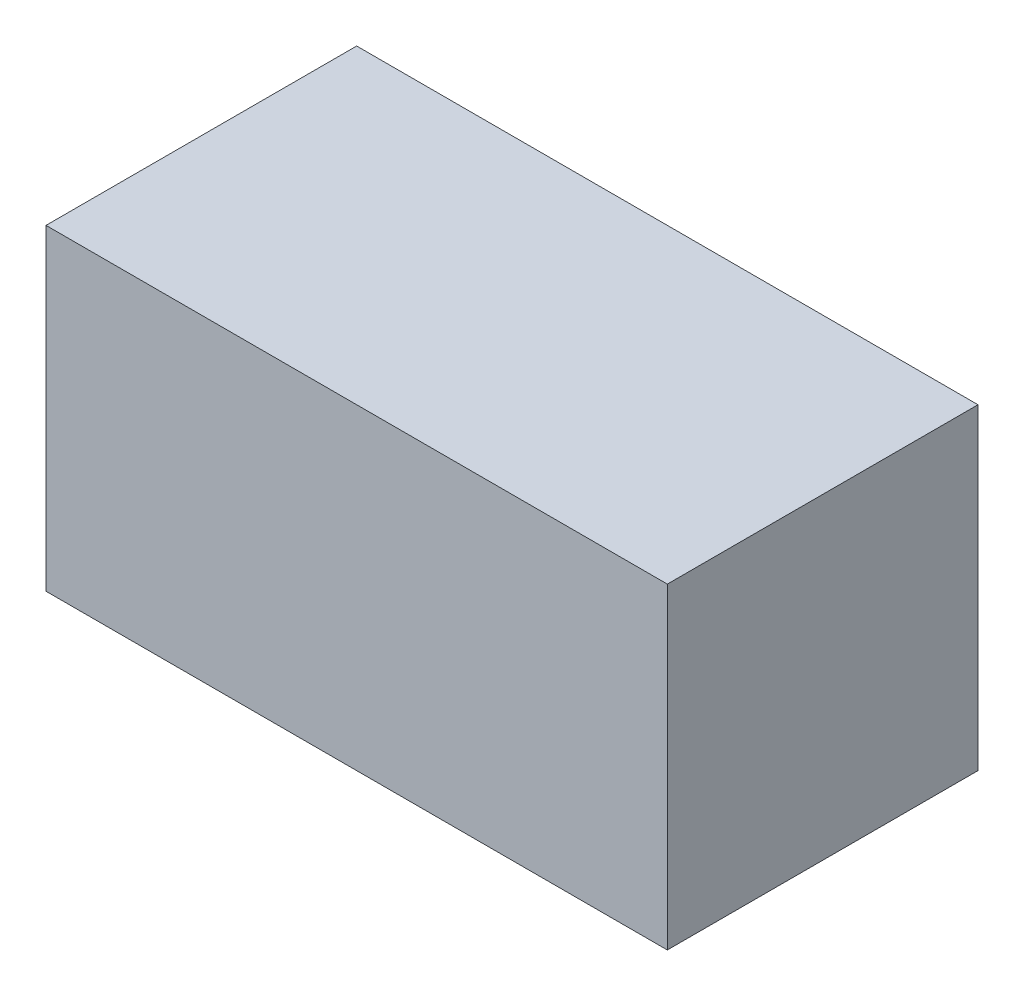
ISO-10303-21;
HEADER;
FILE_DESCRIPTION(('STEP AP214'),'2;1');
FILE_NAME('part.step','',(''),(''),'','','');
FILE_SCHEMA(('AUTOMOTIVE_DESIGN { 1 0 10303 214 1 1 1 1 }'));
ENDSEC;
DATA;
#1=APPLICATION_CONTEXT('core data for automotive mechanical design processes');
#2=APPLICATION_PROTOCOL_DEFINITION('international standard','automotive_design',2000,#1);
#3=PRODUCT_CONTEXT('',#1,'mechanical');
#4=PRODUCT('Part','Part','',(#3));
#5=PRODUCT_RELATED_PRODUCT_CATEGORY('part','',(#4));
#6=PRODUCT_DEFINITION_FORMATION('','',#4);
#7=PRODUCT_DEFINITION_CONTEXT('part definition',#1,'design');
#8=PRODUCT_DEFINITION('design','',#6,#7);
#9=PRODUCT_DEFINITION_SHAPE('','',#8);
#10=(LENGTH_UNIT() NAMED_UNIT(*) SI_UNIT(.MILLI.,.METRE.));
#11=(NAMED_UNIT(*) PLANE_ANGLE_UNIT() SI_UNIT($,.RADIAN.));
#12=(NAMED_UNIT(*) SI_UNIT($,.STERADIAN.) SOLID_ANGLE_UNIT());
#13=UNCERTAINTY_MEASURE_WITH_UNIT(LENGTH_MEASURE(1.E-05),#10,'distance_accuracy_value','');
#14=(GEOMETRIC_REPRESENTATION_CONTEXT(3) GLOBAL_UNCERTAINTY_ASSIGNED_CONTEXT((#13)) GLOBAL_UNIT_ASSIGNED_CONTEXT((#10,
#11,#12)) REPRESENTATION_CONTEXT('',''));
#15=CARTESIAN_POINT('',(0.,0.,0.));
#16=DIRECTION('',(0.,0.,1.));
#17=DIRECTION('',(1.,0.,0.));
#18=AXIS2_PLACEMENT_3D('',#15,#16,#17);
#19=CARTESIAN_POINT('',(-5.00000016,2.54999998,5.00000016));
#20=DIRECTION('',(0.,0.,1.));
#21=DIRECTION('',(1.,0.,0.));
#22=AXIS2_PLACEMENT_3D('',#19,#20,#21);
#23=PLANE('',#22);
#24=DIRECTION('',(0.,1.,0.));
#25=VECTOR('',#24,1.);
#26=CARTESIAN_POINT('',(5.00000016,2.54999998,5.00000016));
#27=LINE('',#26,#25);
#28=CARTESIAN_POINT('',(5.00000016,2.54999998,5.00000016));
#29=VERTEX_POINT('',#28);
#30=CARTESIAN_POINT('',(5.00000016,-2.54999998,5.00000016));
#31=VERTEX_POINT('',#30);
#32=EDGE_CURVE('E53',#29,#31,#27,.F.);
#33=ORIENTED_EDGE('',*,*,#32,.F.);
#34=DIRECTION('',(1.,0.,0.));
#35=VECTOR('',#34,1.);
#36=CARTESIAN_POINT('',(-5.00000016,2.54999998,5.00000016));
#37=LINE('',#36,#35);
#38=CARTESIAN_POINT('',(-5.00000016,2.54999998,5.00000016));
#39=VERTEX_POINT('',#38);
#40=EDGE_CURVE('E68',#39,#29,#37,.T.);
#41=ORIENTED_EDGE('',*,*,#40,.F.);
#42=DIRECTION('',(0.,1.,0.));
#43=VECTOR('',#42,1.);
#44=CARTESIAN_POINT('',(-5.00000016,-2.54999998,5.00000016));
#45=LINE('',#44,#43);
#46=CARTESIAN_POINT('',(-5.00000016,-2.54999998,5.00000016));
#47=VERTEX_POINT('',#46);
#48=EDGE_CURVE('E20',#47,#39,#45,.T.);
#49=ORIENTED_EDGE('',*,*,#48,.F.);
#50=DIRECTION('',(1.,0.,0.));
#51=VECTOR('',#50,1.);
#52=CARTESIAN_POINT('',(5.00000016,-2.54999998,5.00000016));
#53=LINE('',#52,#51);
#54=EDGE_CURVE('E58',#31,#47,#53,.F.);
#55=ORIENTED_EDGE('',*,*,#54,.F.);
#56=EDGE_LOOP('',(#33,#41,#49,#55));
#57=FACE_BOUND('',#56,.T.);
#58=ADVANCED_FACE('F17',(#57),#23,.T.);
#59=CARTESIAN_POINT('',(-5.00000016,-2.54999998,0.));
#60=DIRECTION('',(-1.,0.,0.));
#61=DIRECTION('',(0.,0.,1.));
#62=AXIS2_PLACEMENT_3D('',#59,#60,#61);
#63=PLANE('',#62);
#64=DIRECTION('',(0.,0.,1.));
#65=VECTOR('',#64,1.);
#66=CARTESIAN_POINT('',(-5.00000016,2.54999998,0.));
#67=LINE('',#66,#65);
#68=CARTESIAN_POINT('',(-5.00000016,2.54999998,0.));
#69=VERTEX_POINT('',#68);
#70=EDGE_CURVE('E79',#69,#39,#67,.T.);
#71=ORIENTED_EDGE('',*,*,#70,.F.);
#72=DIRECTION('',(0.,1.,0.));
#73=VECTOR('',#72,1.);
#74=CARTESIAN_POINT('',(-5.00000016,2.54999998,0.));
#75=LINE('',#74,#73);
#76=CARTESIAN_POINT('',(-5.00000016,-2.54999998,0.));
#77=VERTEX_POINT('',#76);
#78=EDGE_CURVE('E74',#69,#77,#75,.F.);
#79=ORIENTED_EDGE('',*,*,#78,.T.);
#80=DIRECTION('',(0.,0.,-1.));
#81=VECTOR('',#80,1.);
#82=CARTESIAN_POINT('',(-5.00000016,-2.54999998,0.));
#83=LINE('',#82,#81);
#84=EDGE_CURVE('E63',#47,#77,#83,.T.);
#85=ORIENTED_EDGE('',*,*,#84,.F.);
#86=ORIENTED_EDGE('',*,*,#48,.T.);
#87=EDGE_LOOP('',(#71,#79,#85,#86));
#88=FACE_BOUND('',#87,.T.);
#89=ADVANCED_FACE('F73',(#88),#63,.T.);
#90=CARTESIAN_POINT('',(5.00000016,-2.54999998,0.));
#91=DIRECTION('',(0.,-1.,0.));
#92=DIRECTION('',(0.,0.,-1.));
#93=AXIS2_PLACEMENT_3D('',#90,#91,#92);
#94=PLANE('',#93);
#95=ORIENTED_EDGE('',*,*,#84,.T.);
#96=DIRECTION('',(1.,0.,0.));
#97=VECTOR('',#96,1.);
#98=CARTESIAN_POINT('',(-5.00000016,-2.54999998,0.));
#99=LINE('',#98,#97);
#100=CARTESIAN_POINT('',(5.00000016,-2.54999998,0.));
#101=VERTEX_POINT('',#100);
#102=EDGE_CURVE('E84',#77,#101,#99,.T.);
#103=ORIENTED_EDGE('',*,*,#102,.T.);
#104=DIRECTION('',(0.,0.,-1.));
#105=VECTOR('',#104,1.);
#106=CARTESIAN_POINT('',(5.00000016,-2.54999998,0.));
#107=LINE('',#106,#105);
#108=EDGE_CURVE('E65',#31,#101,#107,.T.);
#109=ORIENTED_EDGE('',*,*,#108,.F.);
#110=ORIENTED_EDGE('',*,*,#54,.T.);
#111=EDGE_LOOP('',(#95,#103,#109,#110));
#112=FACE_BOUND('',#111,.T.);
#113=ADVANCED_FACE('F60',(#112),#94,.T.);
#114=CARTESIAN_POINT('',(5.00000016,2.54999998,0.));
#115=DIRECTION('',(1.,0.,0.));
#116=DIRECTION('',(0.,0.,-1.));
#117=AXIS2_PLACEMENT_3D('',#114,#115,#116);
#118=PLANE('',#117);
#119=ORIENTED_EDGE('',*,*,#108,.T.);
#120=DIRECTION('',(0.,1.,0.));
#121=VECTOR('',#120,1.);
#122=CARTESIAN_POINT('',(5.00000016,2.54999998,0.));
#123=LINE('',#122,#121);
#124=CARTESIAN_POINT('',(5.00000016,2.54999998,0.));
#125=VERTEX_POINT('',#124);
#126=EDGE_CURVE('E26',#101,#125,#123,.T.);
#127=ORIENTED_EDGE('',*,*,#126,.T.);
#128=DIRECTION('',(0.,0.,1.));
#129=VECTOR('',#128,1.);
#130=CARTESIAN_POINT('',(5.00000016,2.54999998,0.));
#131=LINE('',#130,#129);
#132=EDGE_CURVE('E34',#29,#125,#131,.F.);
#133=ORIENTED_EDGE('',*,*,#132,.F.);
#134=ORIENTED_EDGE('',*,*,#32,.T.);
#135=EDGE_LOOP('',(#119,#127,#133,#134));
#136=FACE_BOUND('',#135,.T.);
#137=ADVANCED_FACE('F88',(#136),#118,.T.);
#138=CARTESIAN_POINT('',(-5.00000016,2.54999998,0.));
#139=DIRECTION('',(0.,1.,0.));
#140=DIRECTION('',(0.,0.,1.));
#141=AXIS2_PLACEMENT_3D('',#138,#139,#140);
#142=PLANE('',#141);
#143=ORIENTED_EDGE('',*,*,#132,.T.);
#144=DIRECTION('',(1.,0.,0.));
#145=VECTOR('',#144,1.);
#146=CARTESIAN_POINT('',(-5.00000016,2.54999998,0.));
#147=LINE('',#146,#145);
#148=EDGE_CURVE('E11',#125,#69,#147,.F.);
#149=ORIENTED_EDGE('',*,*,#148,.T.);
#150=ORIENTED_EDGE('',*,*,#70,.T.);
#151=ORIENTED_EDGE('',*,*,#40,.T.);
#152=EDGE_LOOP('',(#143,#149,#150,#151));
#153=FACE_BOUND('',#152,.T.);
#154=ADVANCED_FACE('F91',(#153),#142,.T.);
#155=CARTESIAN_POINT('',(-5.00000016,2.54999998,0.));
#156=DIRECTION('',(0.,0.,1.));
#157=DIRECTION('',(1.,0.,0.));
#158=AXIS2_PLACEMENT_3D('',#155,#156,#157);
#159=PLANE('',#158);
#160=ORIENTED_EDGE('',*,*,#126,.F.);
#161=ORIENTED_EDGE('',*,*,#102,.F.);
#162=ORIENTED_EDGE('',*,*,#78,.F.);
#163=ORIENTED_EDGE('',*,*,#148,.F.);
#164=EDGE_LOOP('',(#160,#161,#162,#163));
#165=FACE_BOUND('',#164,.T.);
#166=ADVANCED_FACE('F90',(#165),#159,.F.);
#167=CLOSED_SHELL('',(#58,#89,#113,#137,#154,#166));
#168=MANIFOLD_SOLID_BREP('B1',#167);
#169=ADVANCED_BREP_SHAPE_REPRESENTATION('',(#18,#168),#14);
#170=SHAPE_DEFINITION_REPRESENTATION(#9,#169);
ENDSEC;
END-ISO-10303-21;
